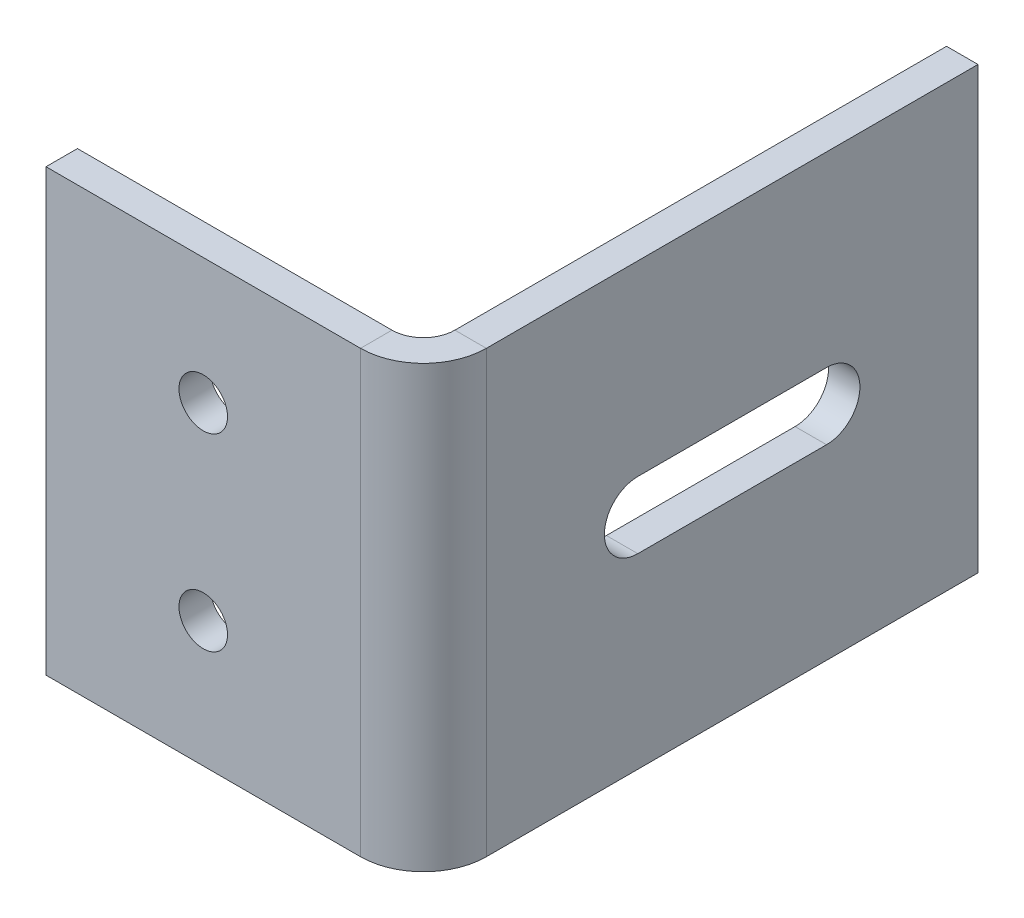
ISO-10303-21;
HEADER;
FILE_DESCRIPTION(('STEP AP214'),'2;1');
FILE_NAME('part.step','',(''),(''),'','','');
FILE_SCHEMA(('AUTOMOTIVE_DESIGN { 1 0 10303 214 1 1 1 1 }'));
ENDSEC;
DATA;
#1=APPLICATION_CONTEXT('core data for automotive mechanical design processes');
#2=APPLICATION_PROTOCOL_DEFINITION('international standard','automotive_design',2000,#1);
#3=PRODUCT_CONTEXT('',#1,'mechanical');
#4=PRODUCT('Part','Part','',(#3));
#5=PRODUCT_RELATED_PRODUCT_CATEGORY('part','',(#4));
#6=PRODUCT_DEFINITION_FORMATION('','',#4);
#7=PRODUCT_DEFINITION_CONTEXT('part definition',#1,'design');
#8=PRODUCT_DEFINITION('design','',#6,#7);
#9=PRODUCT_DEFINITION_SHAPE('','',#8);
#10=(LENGTH_UNIT() NAMED_UNIT(*) SI_UNIT(.MILLI.,.METRE.));
#11=(NAMED_UNIT(*) PLANE_ANGLE_UNIT() SI_UNIT($,.RADIAN.));
#12=(NAMED_UNIT(*) SI_UNIT($,.STERADIAN.) SOLID_ANGLE_UNIT());
#13=UNCERTAINTY_MEASURE_WITH_UNIT(LENGTH_MEASURE(1.E-05),#10,'distance_accuracy_value','');
#14=(GEOMETRIC_REPRESENTATION_CONTEXT(3) GLOBAL_UNCERTAINTY_ASSIGNED_CONTEXT((#13)) GLOBAL_UNIT_ASSIGNED_CONTEXT((#10,
#11,#12)) REPRESENTATION_CONTEXT('',''));
#15=CARTESIAN_POINT('',(0.,0.,0.));
#16=DIRECTION('',(0.,0.,1.));
#17=DIRECTION('',(1.,0.,0.));
#18=AXIS2_PLACEMENT_3D('',#15,#16,#17);
#19=CARTESIAN_POINT('',(-19.05,-22.225,-3.175));
#20=DIRECTION('',(0.,-1.,0.));
#21=DIRECTION('',(0.,0.,-1.));
#22=AXIS2_PLACEMENT_3D('',#19,#20,#21);
#23=PLANE('',#22);
#24=DIRECTION('',(1.,0.,0.));
#25=VECTOR('',#24,1.);
#26=CARTESIAN_POINT('',(-19.05,-22.225,-3.175));
#27=LINE('',#26,#25);
#28=CARTESIAN_POINT('',(-19.05,-22.225,-3.175));
#29=VERTEX_POINT('',#28);
#30=CARTESIAN_POINT('',(12.7,-22.225,-3.175));
#31=VERTEX_POINT('',#30);
#32=EDGE_CURVE('E298',#29,#31,#27,.T.);
#33=ORIENTED_EDGE('',*,*,#32,.T.);
#34=DIRECTION('',(0.,0.,1.));
#35=VECTOR('',#34,1.);
#36=CARTESIAN_POINT('',(12.7,-22.225,-3.175));
#37=LINE('',#36,#35);
#38=CARTESIAN_POINT('',(12.7,-22.225,0.));
#39=VERTEX_POINT('',#38);
#40=EDGE_CURVE('E268',#31,#39,#37,.T.);
#41=ORIENTED_EDGE('',*,*,#40,.T.);
#42=DIRECTION('',(1.,0.,0.));
#43=VECTOR('',#42,1.);
#44=CARTESIAN_POINT('',(-19.05,-22.225,0.));
#45=LINE('',#44,#43);
#46=CARTESIAN_POINT('',(-19.05,-22.225,0.));
#47=VERTEX_POINT('',#46);
#48=EDGE_CURVE('E294',#47,#39,#45,.T.);
#49=ORIENTED_EDGE('',*,*,#48,.F.);
#50=DIRECTION('',(0.,0.,1.));
#51=VECTOR('',#50,1.);
#52=CARTESIAN_POINT('',(-19.05,-22.225,-3.175));
#53=LINE('',#52,#51);
#54=EDGE_CURVE('E13',#29,#47,#53,.T.);
#55=ORIENTED_EDGE('',*,*,#54,.F.);
#56=EDGE_LOOP('',(#33,#41,#49,#55));
#57=FACE_BOUND('',#56,.T.);
#58=ADVANCED_FACE('F62',(#57),#23,.T.);
#59=CARTESIAN_POINT('',(0.,0.,-3.175));
#60=DIRECTION('',(0.,0.,1.));
#61=DIRECTION('',(1.,0.,0.));
#62=AXIS2_PLACEMENT_3D('',#59,#60,#61);
#63=PLANE('',#62);
#64=CARTESIAN_POINT('',(-3.175,9.525,-3.175));
#65=DIRECTION('',(0.,0.,-1.));
#66=DIRECTION('',(-1.,0.,0.));
#67=AXIS2_PLACEMENT_3D('',#64,#65,#66);
#68=CIRCLE('',#67,2.4511);
#69=CARTESIAN_POINT('',(-5.6261,9.525,-3.175));
#70=VERTEX_POINT('',#69);
#71=EDGE_CURVE('E206',#70,#70,#68,.T.);
#72=ORIENTED_EDGE('',*,*,#71,.F.);
#73=EDGE_LOOP('',(#72));
#74=FACE_BOUND('',#73,.T.);
#75=CARTESIAN_POINT('',(-3.175,-9.525,-3.175));
#76=DIRECTION('',(0.,0.,-1.));
#77=DIRECTION('',(-1.,0.,0.));
#78=AXIS2_PLACEMENT_3D('',#75,#76,#77);
#79=CIRCLE('',#78,2.4511);
#80=CARTESIAN_POINT('',(-5.6261,-9.525,-3.175));
#81=VERTEX_POINT('',#80);
#82=EDGE_CURVE('E195',#81,#81,#79,.T.);
#83=ORIENTED_EDGE('',*,*,#82,.F.);
#84=EDGE_LOOP('',(#83));
#85=FACE_BOUND('',#84,.T.);
#86=DIRECTION('',(0.,-1.,0.));
#87=VECTOR('',#86,1.);
#88=CARTESIAN_POINT('',(12.7,-22.225,-3.175));
#89=LINE('',#88,#87);
#90=CARTESIAN_POINT('',(12.7,22.225,-3.175));
#91=VERTEX_POINT('',#90);
#92=EDGE_CURVE('E276',#31,#91,#89,.F.);
#93=ORIENTED_EDGE('',*,*,#92,.F.);
#94=ORIENTED_EDGE('',*,*,#32,.F.);
#95=DIRECTION('',(0.,-1.,0.));
#96=VECTOR('',#95,1.);
#97=CARTESIAN_POINT('',(-19.05,22.225,-3.175));
#98=LINE('',#97,#96);
#99=CARTESIAN_POINT('',(-19.05,22.225,-3.175));
#100=VERTEX_POINT('',#99);
#101=EDGE_CURVE('E293',#100,#29,#98,.T.);
#102=ORIENTED_EDGE('',*,*,#101,.F.);
#103=DIRECTION('',(-1.,0.,0.));
#104=VECTOR('',#103,1.);
#105=CARTESIAN_POINT('',(-19.05,22.225,-3.175));
#106=LINE('',#105,#104);
#107=EDGE_CURVE('E290',#91,#100,#106,.T.);
#108=ORIENTED_EDGE('',*,*,#107,.F.);
#109=EDGE_LOOP('',(#93,#94,#102,#108));
#110=FACE_BOUND('',#109,.T.);
#111=ADVANCED_FACE('F329',(#74,#85,#110),#63,.F.);
#112=CARTESIAN_POINT('',(0.,0.,0.));
#113=DIRECTION('',(0.,0.,1.));
#114=DIRECTION('',(1.,0.,0.));
#115=AXIS2_PLACEMENT_3D('',#112,#113,#114);
#116=PLANE('',#115);
#117=CARTESIAN_POINT('',(-3.175,9.525,0.));
#118=DIRECTION('',(0.,0.,-1.));
#119=DIRECTION('',(-1.,0.,0.));
#120=AXIS2_PLACEMENT_3D('',#117,#118,#119);
#121=CIRCLE('',#120,2.4511);
#122=CARTESIAN_POINT('',(-5.6261,9.525,0.));
#123=VERTEX_POINT('',#122);
#124=EDGE_CURVE('E201',#123,#123,#121,.T.);
#125=ORIENTED_EDGE('',*,*,#124,.T.);
#126=EDGE_LOOP('',(#125));
#127=FACE_BOUND('',#126,.T.);
#128=CARTESIAN_POINT('',(-3.175,-9.525,0.));
#129=DIRECTION('',(0.,0.,-1.));
#130=DIRECTION('',(-1.,0.,0.));
#131=AXIS2_PLACEMENT_3D('',#128,#129,#130);
#132=CIRCLE('',#131,2.4511);
#133=CARTESIAN_POINT('',(-5.6261,-9.525,0.));
#134=VERTEX_POINT('',#133);
#135=EDGE_CURVE('E210',#134,#134,#132,.T.);
#136=ORIENTED_EDGE('',*,*,#135,.T.);
#137=EDGE_LOOP('',(#136));
#138=FACE_BOUND('',#137,.T.);
#139=ORIENTED_EDGE('',*,*,#48,.T.);
#140=DIRECTION('',(0.,-1.,0.));
#141=VECTOR('',#140,1.);
#142=CARTESIAN_POINT('',(12.7,-22.225,0.));
#143=LINE('',#142,#141);
#144=CARTESIAN_POINT('',(12.7,22.225,0.));
#145=VERTEX_POINT('',#144);
#146=EDGE_CURVE('E259',#39,#145,#143,.F.);
#147=ORIENTED_EDGE('',*,*,#146,.T.);
#148=DIRECTION('',(-1.,0.,0.));
#149=VECTOR('',#148,1.);
#150=CARTESIAN_POINT('',(-19.05,22.225,0.));
#151=LINE('',#150,#149);
#152=CARTESIAN_POINT('',(-19.05,22.225,0.));
#153=VERTEX_POINT('',#152);
#154=EDGE_CURVE('E286',#145,#153,#151,.T.);
#155=ORIENTED_EDGE('',*,*,#154,.T.);
#156=DIRECTION('',(0.,-1.,0.));
#157=VECTOR('',#156,1.);
#158=CARTESIAN_POINT('',(-19.05,22.225,0.));
#159=LINE('',#158,#157);
#160=EDGE_CURVE('E304',#153,#47,#159,.T.);
#161=ORIENTED_EDGE('',*,*,#160,.T.);
#162=EDGE_LOOP('',(#139,#147,#155,#161));
#163=FACE_BOUND('',#162,.T.);
#164=ADVANCED_FACE('F313',(#127,#138,#163),#116,.T.);
#165=CARTESIAN_POINT('',(-19.05,22.225,-3.175));
#166=DIRECTION('',(-1.,0.,0.));
#167=DIRECTION('',(0.,-1.,0.));
#168=AXIS2_PLACEMENT_3D('',#165,#166,#167);
#169=PLANE('',#168);
#170=ORIENTED_EDGE('',*,*,#160,.F.);
#171=DIRECTION('',(0.,0.,1.));
#172=VECTOR('',#171,1.);
#173=CARTESIAN_POINT('',(-19.05,22.225,-3.175));
#174=LINE('',#173,#172);
#175=EDGE_CURVE('E66',#100,#153,#174,.T.);
#176=ORIENTED_EDGE('',*,*,#175,.F.);
#177=ORIENTED_EDGE('',*,*,#101,.T.);
#178=ORIENTED_EDGE('',*,*,#54,.T.);
#179=EDGE_LOOP('',(#170,#176,#177,#178));
#180=FACE_BOUND('',#179,.T.);
#181=ADVANCED_FACE('F336',(#180),#169,.T.);
#182=CARTESIAN_POINT('',(-19.05,22.225,-3.175));
#183=DIRECTION('',(0.,1.,0.));
#184=DIRECTION('',(0.,0.,1.));
#185=AXIS2_PLACEMENT_3D('',#182,#183,#184);
#186=PLANE('',#185);
#187=DIRECTION('',(0.,0.,1.));
#188=VECTOR('',#187,1.);
#189=CARTESIAN_POINT('',(12.7,22.225,-3.175));
#190=LINE('',#189,#188);
#191=EDGE_CURVE('E282',#91,#145,#190,.T.);
#192=ORIENTED_EDGE('',*,*,#191,.F.);
#193=ORIENTED_EDGE('',*,*,#107,.T.);
#194=ORIENTED_EDGE('',*,*,#175,.T.);
#195=ORIENTED_EDGE('',*,*,#154,.F.);
#196=EDGE_LOOP('',(#192,#193,#194,#195));
#197=FACE_BOUND('',#196,.T.);
#198=ADVANCED_FACE('F64',(#197),#186,.T.);
#199=CARTESIAN_POINT('',(12.7,22.225,-6.35));
#200=DIRECTION('',(0.,1.,0.));
#201=DIRECTION('',(0.,0.,1.));
#202=AXIS2_PLACEMENT_3D('',#199,#200,#201);
#203=PLANE('',#202);
#204=DIRECTION('',(-1.,0.,0.));
#205=VECTOR('',#204,1.);
#206=CARTESIAN_POINT('',(19.05,22.225,-6.34999999999998));
#207=LINE('',#206,#205);
#208=CARTESIAN_POINT('',(15.875,22.225,-6.34999999999999));
#209=VERTEX_POINT('',#208);
#210=CARTESIAN_POINT('',(19.05,22.225,-6.34999999999998));
#211=VERTEX_POINT('',#210);
#212=EDGE_CURVE('E205',#209,#211,#207,.F.);
#213=ORIENTED_EDGE('',*,*,#212,.F.);
#214=CARTESIAN_POINT('',(12.7,22.225,-6.35));
#215=DIRECTION('',(0.,-1.,0.));
#216=DIRECTION('',(0.,0.,-1.));
#217=AXIS2_PLACEMENT_3D('',#214,#215,#216);
#218=CIRCLE('',#217,3.175);
#219=EDGE_CURVE('E272',#91,#209,#218,.F.);
#220=ORIENTED_EDGE('',*,*,#219,.F.);
#221=ORIENTED_EDGE('',*,*,#191,.T.);
#222=CARTESIAN_POINT('',(12.7,22.225,-6.35));
#223=DIRECTION('',(0.,-1.,0.));
#224=DIRECTION('',(0.,0.,-1.));
#225=AXIS2_PLACEMENT_3D('',#222,#223,#224);
#226=CIRCLE('',#225,6.35);
#227=EDGE_CURVE('E263',#145,#211,#226,.F.);
#228=ORIENTED_EDGE('',*,*,#227,.T.);
#229=EDGE_LOOP('',(#213,#220,#221,#228));
#230=FACE_BOUND('',#229,.T.);
#231=ADVANCED_FACE('F348',(#230),#203,.T.);
#232=CARTESIAN_POINT('',(12.7,-22.225,-6.35));
#233=DIRECTION('',(0.,1.,0.));
#234=DIRECTION('',(0.,0.,1.));
#235=AXIS2_PLACEMENT_3D('',#232,#233,#234);
#236=PLANE('',#235);
#237=CARTESIAN_POINT('',(12.7,-22.225,-6.35));
#238=DIRECTION('',(0.,-1.,0.));
#239=DIRECTION('',(0.,0.,-1.));
#240=AXIS2_PLACEMENT_3D('',#237,#238,#239);
#241=CIRCLE('',#240,3.175);
#242=CARTESIAN_POINT('',(15.875,-22.225,-6.34999999999999));
#243=VERTEX_POINT('',#242);
#244=EDGE_CURVE('E221',#243,#31,#241,.T.);
#245=ORIENTED_EDGE('',*,*,#244,.F.);
#246=DIRECTION('',(-1.,0.,0.));
#247=VECTOR('',#246,1.);
#248=CARTESIAN_POINT('',(15.875,-22.225,-6.34999999999999));
#249=LINE('',#248,#247);
#250=CARTESIAN_POINT('',(19.05,-22.225,-6.34999999999998));
#251=VERTEX_POINT('',#250);
#252=EDGE_CURVE('E249',#243,#251,#249,.F.);
#253=ORIENTED_EDGE('',*,*,#252,.T.);
#254=CARTESIAN_POINT('',(12.7,-22.225,-6.35));
#255=DIRECTION('',(0.,-1.,0.));
#256=DIRECTION('',(0.,0.,-1.));
#257=AXIS2_PLACEMENT_3D('',#254,#255,#256);
#258=CIRCLE('',#257,6.35);
#259=EDGE_CURVE('E264',#251,#39,#258,.T.);
#260=ORIENTED_EDGE('',*,*,#259,.T.);
#261=ORIENTED_EDGE('',*,*,#40,.F.);
#262=EDGE_LOOP('',(#245,#253,#260,#261));
#263=FACE_BOUND('',#262,.T.);
#264=ADVANCED_FACE('F320',(#263),#236,.F.);
#265=CARTESIAN_POINT('',(12.7,-22.225,-6.35));
#266=DIRECTION('',(0.,-1.,0.));
#267=DIRECTION('',(1.,0.,0.));
#268=AXIS2_PLACEMENT_3D('',#265,#266,#267);
#269=CYLINDRICAL_SURFACE('',#268,6.35);
#270=ORIENTED_EDGE('',*,*,#146,.F.);
#271=ORIENTED_EDGE('',*,*,#259,.F.);
#272=DIRECTION('',(0.,-1.,0.));
#273=VECTOR('',#272,1.);
#274=CARTESIAN_POINT('',(19.05,22.225,-6.34999999999998));
#275=LINE('',#274,#273);
#276=EDGE_CURVE('E246',#251,#211,#275,.F.);
#277=ORIENTED_EDGE('',*,*,#276,.T.);
#278=ORIENTED_EDGE('',*,*,#227,.F.);
#279=EDGE_LOOP('',(#270,#271,#277,#278));
#280=FACE_BOUND('',#279,.T.);
#281=ADVANCED_FACE('F361',(#280),#269,.T.);
#282=CARTESIAN_POINT('',(12.7,-22.225,-6.35));
#283=DIRECTION('',(0.,-1.,0.));
#284=DIRECTION('',(1.,0.,0.));
#285=AXIS2_PLACEMENT_3D('',#282,#283,#284);
#286=CYLINDRICAL_SURFACE('',#285,3.175);
#287=ORIENTED_EDGE('',*,*,#92,.T.);
#288=ORIENTED_EDGE('',*,*,#219,.T.);
#289=DIRECTION('',(0.,-1.,0.));
#290=VECTOR('',#289,1.);
#291=CARTESIAN_POINT('',(15.875,22.225,-6.34999999999999));
#292=LINE('',#291,#290);
#293=EDGE_CURVE('E253',#209,#243,#292,.T.);
#294=ORIENTED_EDGE('',*,*,#293,.T.);
#295=ORIENTED_EDGE('',*,*,#244,.T.);
#296=EDGE_LOOP('',(#287,#288,#294,#295));
#297=FACE_BOUND('',#296,.T.);
#298=ADVANCED_FACE('F324',(#297),#286,.F.);
#299=CARTESIAN_POINT('',(19.0500000000002,-22.225,-55.9816));
#300=DIRECTION('',(0.,1.,0.));
#301=DIRECTION('',(-1.,0.,0.));
#302=AXIS2_PLACEMENT_3D('',#299,#300,#301);
#303=PLANE('',#302);
#304=ORIENTED_EDGE('',*,*,#252,.F.);
#305=DIRECTION('',(0.,0.,1.));
#306=VECTOR('',#305,1.);
#307=CARTESIAN_POINT('',(15.8750000000002,-22.225,-55.9816));
#308=LINE('',#307,#306);
#309=CARTESIAN_POINT('',(15.8750000000002,-22.225,-55.9816));
#310=VERTEX_POINT('',#309);
#311=EDGE_CURVE('E243',#243,#310,#308,.F.);
#312=ORIENTED_EDGE('',*,*,#311,.T.);
#313=DIRECTION('',(-1.,0.,0.));
#314=VECTOR('',#313,1.);
#315=CARTESIAN_POINT('',(19.0500000000002,-22.225,-55.9816));
#316=LINE('',#315,#314);
#317=CARTESIAN_POINT('',(19.0500000000002,-22.225,-55.9816));
#318=VERTEX_POINT('',#317);
#319=EDGE_CURVE('E217',#318,#310,#316,.T.);
#320=ORIENTED_EDGE('',*,*,#319,.F.);
#321=DIRECTION('',(0.,0.,-1.));
#322=VECTOR('',#321,1.);
#323=CARTESIAN_POINT('',(19.05,-22.225,0.));
#324=LINE('',#323,#322);
#325=EDGE_CURVE('E233',#251,#318,#324,.T.);
#326=ORIENTED_EDGE('',*,*,#325,.F.);
#327=EDGE_LOOP('',(#304,#312,#320,#326));
#328=FACE_BOUND('',#327,.T.);
#329=ADVANCED_FACE('F367',(#328),#303,.F.);
#330=CARTESIAN_POINT('',(19.05,22.225,-3.17499999999999));
#331=DIRECTION('',(0.,-1.,0.));
#332=DIRECTION('',(1.,0.,0.));
#333=AXIS2_PLACEMENT_3D('',#330,#331,#332);
#334=PLANE('',#333);
#335=ORIENTED_EDGE('',*,*,#212,.T.);
#336=DIRECTION('',(0.,0.,1.));
#337=VECTOR('',#336,1.);
#338=CARTESIAN_POINT('',(19.05,22.225,0.));
#339=LINE('',#338,#337);
#340=CARTESIAN_POINT('',(19.0500000000002,22.225,-55.9816));
#341=VERTEX_POINT('',#340);
#342=EDGE_CURVE('E226',#341,#211,#339,.T.);
#343=ORIENTED_EDGE('',*,*,#342,.F.);
#344=DIRECTION('',(-1.,0.,0.));
#345=VECTOR('',#344,1.);
#346=CARTESIAN_POINT('',(19.0500000000002,22.225,-55.9816));
#347=LINE('',#346,#345);
#348=CARTESIAN_POINT('',(15.8750000000002,22.225,-55.9816));
#349=VERTEX_POINT('',#348);
#350=EDGE_CURVE('E222',#341,#349,#347,.T.);
#351=ORIENTED_EDGE('',*,*,#350,.T.);
#352=DIRECTION('',(0.,0.,-1.));
#353=VECTOR('',#352,1.);
#354=CARTESIAN_POINT('',(15.875,22.225,-3.175));
#355=LINE('',#354,#353);
#356=EDGE_CURVE('E236',#349,#209,#355,.F.);
#357=ORIENTED_EDGE('',*,*,#356,.T.);
#358=EDGE_LOOP('',(#335,#343,#351,#357));
#359=FACE_BOUND('',#358,.T.);
#360=ADVANCED_FACE('F373',(#359),#334,.F.);
#361=CARTESIAN_POINT('',(19.05,0.,0.));
#362=DIRECTION('',(-1.,0.,0.));
#363=DIRECTION('',(0.,0.,1.));
#364=AXIS2_PLACEMENT_3D('',#361,#362,#363);
#365=PLANE('',#364);
#366=DIRECTION('',(0.,0.,-1.));
#367=VECTOR('',#366,1.);
#368=CARTESIAN_POINT('',(19.0500000000003,3.3734375,-40.6908));
#369=LINE('',#368,#367);
#370=CARTESIAN_POINT('',(19.0500000000003,3.3734375,-21.6408));
#371=VERTEX_POINT('',#370);
#372=CARTESIAN_POINT('',(19.0500000000003,3.3734375,-40.6908));
#373=VERTEX_POINT('',#372);
#374=EDGE_CURVE('E160',#371,#373,#369,.T.);
#375=ORIENTED_EDGE('',*,*,#374,.T.);
#376=CARTESIAN_POINT('',(19.0500000000003,0.,-40.6908));
#377=DIRECTION('',(-1.,0.,0.));
#378=DIRECTION('',(0.,0.,1.));
#379=AXIS2_PLACEMENT_3D('',#376,#377,#378);
#380=CIRCLE('',#379,3.3734375);
#381=CARTESIAN_POINT('',(19.0500000000003,-3.3734375,-40.6908));
#382=VERTEX_POINT('',#381);
#383=EDGE_CURVE('E153',#373,#382,#380,.T.);
#384=ORIENTED_EDGE('',*,*,#383,.T.);
#385=DIRECTION('',(0.,0.,1.));
#386=VECTOR('',#385,1.);
#387=CARTESIAN_POINT('',(19.0500000000003,-3.3734375,-40.6908));
#388=LINE('',#387,#386);
#389=CARTESIAN_POINT('',(19.0500000000001,-3.3734375,-21.6408));
#390=VERTEX_POINT('',#389);
#391=EDGE_CURVE('E163',#382,#390,#388,.T.);
#392=ORIENTED_EDGE('',*,*,#391,.T.);
#393=CARTESIAN_POINT('',(19.0500000000003,0.,-21.6408));
#394=DIRECTION('',(-1.,0.,0.));
#395=DIRECTION('',(0.,0.,1.));
#396=AXIS2_PLACEMENT_3D('',#393,#394,#395);
#397=CIRCLE('',#396,3.3734375);
#398=EDGE_CURVE('E78',#390,#371,#397,.T.);
#399=ORIENTED_EDGE('',*,*,#398,.T.);
#400=EDGE_LOOP('',(#375,#384,#392,#399));
#401=FACE_BOUND('',#400,.T.);
#402=ORIENTED_EDGE('',*,*,#276,.F.);
#403=ORIENTED_EDGE('',*,*,#325,.T.);
#404=DIRECTION('',(0.,1.,0.));
#405=VECTOR('',#404,1.);
#406=CARTESIAN_POINT('',(19.0500000000002,0.,-55.9816));
#407=LINE('',#406,#405);
#408=EDGE_CURVE('E230',#318,#341,#407,.T.);
#409=ORIENTED_EDGE('',*,*,#408,.T.);
#410=ORIENTED_EDGE('',*,*,#342,.T.);
#411=EDGE_LOOP('',(#402,#403,#409,#410));
#412=FACE_BOUND('',#411,.T.);
#413=ADVANCED_FACE('F168',(#401,#412),#365,.F.);
#414=CARTESIAN_POINT('',(15.875,0.,0.));
#415=DIRECTION('',(-1.,0.,0.));
#416=DIRECTION('',(0.,0.,1.));
#417=AXIS2_PLACEMENT_3D('',#414,#415,#416);
#418=PLANE('',#417);
#419=CARTESIAN_POINT('',(15.8750000000001,0.,-40.6908));
#420=DIRECTION('',(-1.,0.,0.));
#421=DIRECTION('',(0.,0.,1.));
#422=AXIS2_PLACEMENT_3D('',#419,#420,#421);
#423=CIRCLE('',#422,3.3734375);
#424=CARTESIAN_POINT('',(15.8750000000001,3.3734375,-40.6908));
#425=VERTEX_POINT('',#424);
#426=CARTESIAN_POINT('',(15.8750000000001,-3.3734375,-40.6908));
#427=VERTEX_POINT('',#426);
#428=EDGE_CURVE('E86',#425,#427,#423,.T.);
#429=ORIENTED_EDGE('',*,*,#428,.F.);
#430=DIRECTION('',(0.,0.,-1.));
#431=VECTOR('',#430,1.);
#432=CARTESIAN_POINT('',(15.8750000000001,3.3734375,-40.6908));
#433=LINE('',#432,#431);
#434=CARTESIAN_POINT('',(15.8750000000001,3.3734375,-21.6408));
#435=VERTEX_POINT('',#434);
#436=EDGE_CURVE('E172',#435,#425,#433,.T.);
#437=ORIENTED_EDGE('',*,*,#436,.F.);
#438=CARTESIAN_POINT('',(15.8750000000001,0.,-21.6408));
#439=DIRECTION('',(-1.,0.,0.));
#440=DIRECTION('',(0.,0.,1.));
#441=AXIS2_PLACEMENT_3D('',#438,#439,#440);
#442=CIRCLE('',#441,3.3734375);
#443=CARTESIAN_POINT('',(15.8750000000001,-3.3734375,-21.6408));
#444=VERTEX_POINT('',#443);
#445=EDGE_CURVE('E177',#444,#435,#442,.T.);
#446=ORIENTED_EDGE('',*,*,#445,.F.);
#447=DIRECTION('',(0.,0.,1.));
#448=VECTOR('',#447,1.);
#449=CARTESIAN_POINT('',(15.8750000000001,-3.3734375,-40.6908));
#450=LINE('',#449,#448);
#451=EDGE_CURVE('E186',#427,#444,#450,.T.);
#452=ORIENTED_EDGE('',*,*,#451,.F.);
#453=EDGE_LOOP('',(#429,#437,#446,#452));
#454=FACE_BOUND('',#453,.T.);
#455=ORIENTED_EDGE('',*,*,#311,.F.);
#456=ORIENTED_EDGE('',*,*,#293,.F.);
#457=ORIENTED_EDGE('',*,*,#356,.F.);
#458=DIRECTION('',(0.,-1.,0.));
#459=VECTOR('',#458,1.);
#460=CARTESIAN_POINT('',(15.8750000000002,22.225,-55.9816));
#461=LINE('',#460,#459);
#462=EDGE_CURVE('E240',#310,#349,#461,.F.);
#463=ORIENTED_EDGE('',*,*,#462,.F.);
#464=EDGE_LOOP('',(#455,#456,#457,#463));
#465=FACE_BOUND('',#464,.T.);
#466=ADVANCED_FACE('F379',(#454,#465),#418,.T.);
#467=CARTESIAN_POINT('',(19.0500000000002,22.225,-55.9816));
#468=DIRECTION('',(0.,0.,1.));
#469=DIRECTION('',(1.,0.,0.));
#470=AXIS2_PLACEMENT_3D('',#467,#468,#469);
#471=PLANE('',#470);
#472=ORIENTED_EDGE('',*,*,#462,.T.);
#473=ORIENTED_EDGE('',*,*,#350,.F.);
#474=ORIENTED_EDGE('',*,*,#408,.F.);
#475=ORIENTED_EDGE('',*,*,#319,.T.);
#476=EDGE_LOOP('',(#472,#473,#474,#475));
#477=FACE_BOUND('',#476,.T.);
#478=ADVANCED_FACE('F375',(#477),#471,.F.);
#479=CARTESIAN_POINT('',(-3.175,-9.525,0.));
#480=DIRECTION('',(0.,0.,-1.));
#481=DIRECTION('',(-1.,0.,0.));
#482=AXIS2_PLACEMENT_3D('',#479,#480,#481);
#483=CYLINDRICAL_SURFACE('',#482,2.4511);
#484=ORIENTED_EDGE('',*,*,#135,.F.);
#485=EDGE_LOOP('',(#484));
#486=FACE_BOUND('',#485,.T.);
#487=ORIENTED_EDGE('',*,*,#82,.T.);
#488=EDGE_LOOP('',(#487));
#489=FACE_BOUND('',#488,.T.);
#490=ADVANCED_FACE('F378',(#486,#489),#483,.F.);
#491=CARTESIAN_POINT('',(-3.175,9.525,0.));
#492=DIRECTION('',(0.,0.,-1.));
#493=DIRECTION('',(-1.,0.,0.));
#494=AXIS2_PLACEMENT_3D('',#491,#492,#493);
#495=CYLINDRICAL_SURFACE('',#494,2.4511);
#496=ORIENTED_EDGE('',*,*,#124,.F.);
#497=EDGE_LOOP('',(#496));
#498=FACE_BOUND('',#497,.T.);
#499=ORIENTED_EDGE('',*,*,#71,.T.);
#500=EDGE_LOOP('',(#499));
#501=FACE_BOUND('',#500,.T.);
#502=ADVANCED_FACE('F391',(#498,#501),#495,.F.);
#503=CARTESIAN_POINT('',(19.0500000000003,0.,-40.6908));
#504=DIRECTION('',(-1.,0.,0.));
#505=DIRECTION('',(0.,0.,1.));
#506=AXIS2_PLACEMENT_3D('',#503,#504,#505);
#507=CYLINDRICAL_SURFACE('',#506,3.3734375);
#508=ORIENTED_EDGE('',*,*,#428,.T.);
#509=DIRECTION('',(-1.,0.,0.));
#510=VECTOR('',#509,1.);
#511=CARTESIAN_POINT('',(19.0500000000003,-3.3734375,-40.6908));
#512=LINE('',#511,#510);
#513=EDGE_CURVE('E149',#382,#427,#512,.T.);
#514=ORIENTED_EDGE('',*,*,#513,.F.);
#515=ORIENTED_EDGE('',*,*,#383,.F.);
#516=DIRECTION('',(-1.,0.,0.));
#517=VECTOR('',#516,1.);
#518=CARTESIAN_POINT('',(19.0500000000003,3.3734375,-40.6908));
#519=LINE('',#518,#517);
#520=EDGE_CURVE('E192',#373,#425,#519,.T.);
#521=ORIENTED_EDGE('',*,*,#520,.T.);
#522=EDGE_LOOP('',(#508,#514,#515,#521));
#523=FACE_BOUND('',#522,.T.);
#524=ADVANCED_FACE('F151',(#523),#507,.F.);
#525=CARTESIAN_POINT('',(19.0500000000003,3.3734375,-40.6908));
#526=DIRECTION('',(0.,1.,0.));
#527=DIRECTION('',(-1.,0.,0.));
#528=AXIS2_PLACEMENT_3D('',#525,#526,#527);
#529=PLANE('',#528);
#530=ORIENTED_EDGE('',*,*,#436,.T.);
#531=ORIENTED_EDGE('',*,*,#520,.F.);
#532=ORIENTED_EDGE('',*,*,#374,.F.);
#533=DIRECTION('',(-1.,0.,0.));
#534=VECTOR('',#533,1.);
#535=CARTESIAN_POINT('',(19.0500000000003,3.3734375,-21.6408));
#536=LINE('',#535,#534);
#537=EDGE_CURVE('E196',#371,#435,#536,.T.);
#538=ORIENTED_EDGE('',*,*,#537,.T.);
#539=EDGE_LOOP('',(#530,#531,#532,#538));
#540=FACE_BOUND('',#539,.T.);
#541=ADVANCED_FACE('F398',(#540),#529,.F.);
#542=CARTESIAN_POINT('',(19.0500000000003,0.,-21.6408));
#543=DIRECTION('',(-1.,0.,0.));
#544=DIRECTION('',(0.,0.,1.));
#545=AXIS2_PLACEMENT_3D('',#542,#543,#544);
#546=CYLINDRICAL_SURFACE('',#545,3.3734375);
#547=ORIENTED_EDGE('',*,*,#445,.T.);
#548=ORIENTED_EDGE('',*,*,#537,.F.);
#549=ORIENTED_EDGE('',*,*,#398,.F.);
#550=DIRECTION('',(-1.,0.,0.));
#551=VECTOR('',#550,1.);
#552=CARTESIAN_POINT('',(19.0500000000003,-3.3734375,-21.6408));
#553=LINE('',#552,#551);
#554=EDGE_CURVE('E159',#390,#444,#553,.T.);
#555=ORIENTED_EDGE('',*,*,#554,.T.);
#556=EDGE_LOOP('',(#547,#548,#549,#555));
#557=FACE_BOUND('',#556,.T.);
#558=ADVANCED_FACE('F401',(#557),#546,.F.);
#559=CARTESIAN_POINT('',(19.0500000000003,-3.3734375,-40.6908));
#560=DIRECTION('',(0.,-1.,0.));
#561=DIRECTION('',(1.,0.,0.));
#562=AXIS2_PLACEMENT_3D('',#559,#560,#561);
#563=PLANE('',#562);
#564=ORIENTED_EDGE('',*,*,#451,.T.);
#565=ORIENTED_EDGE('',*,*,#554,.F.);
#566=ORIENTED_EDGE('',*,*,#391,.F.);
#567=ORIENTED_EDGE('',*,*,#513,.T.);
#568=EDGE_LOOP('',(#564,#565,#566,#567));
#569=FACE_BOUND('',#568,.T.);
#570=ADVANCED_FACE('F164',(#569),#563,.F.);
#571=CLOSED_SHELL('',(#58,#111,#164,#181,#198,#231,#264,#281,#298,#329,#360,#413,#466,#478,#490,
#502,#524,#541,#558,#570));
#572=MANIFOLD_SOLID_BREP('B2',#571);
#573=ADVANCED_BREP_SHAPE_REPRESENTATION('',(#18,#572),#14);
#574=SHAPE_DEFINITION_REPRESENTATION(#9,#573);
ENDSEC;
END-ISO-10303-21;
